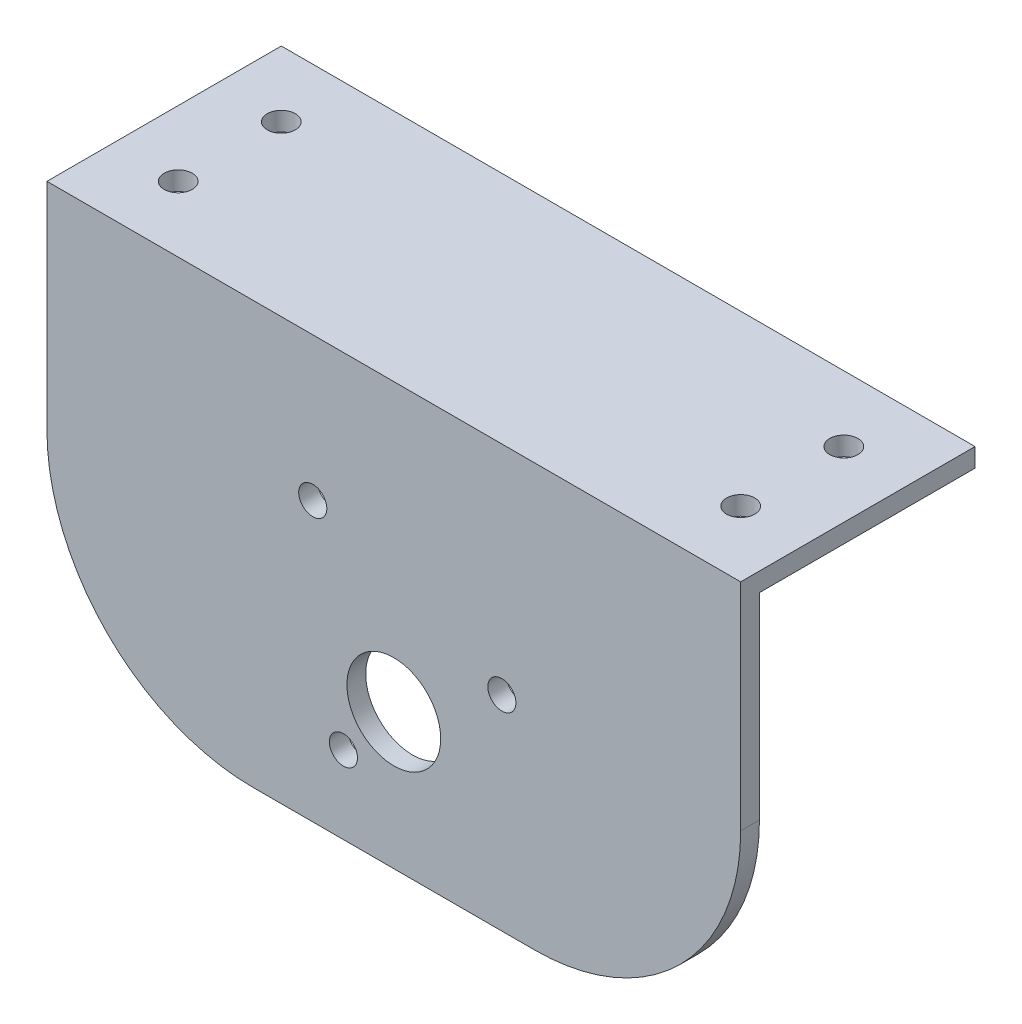
ISO-10303-21;
HEADER;
FILE_DESCRIPTION(('STEP AP214'),'2;1');
FILE_NAME('part.step','',(''),(''),'','','');
FILE_SCHEMA(('AUTOMOTIVE_DESIGN { 1 0 10303 214 1 1 1 1 }'));
ENDSEC;
DATA;
#1=APPLICATION_CONTEXT('core data for automotive mechanical design processes');
#2=APPLICATION_PROTOCOL_DEFINITION('international standard','automotive_design',2000,#1);
#3=PRODUCT_CONTEXT('',#1,'mechanical');
#4=PRODUCT('Part','Part','',(#3));
#5=PRODUCT_RELATED_PRODUCT_CATEGORY('part','',(#4));
#6=PRODUCT_DEFINITION_FORMATION('','',#4);
#7=PRODUCT_DEFINITION_CONTEXT('part definition',#1,'design');
#8=PRODUCT_DEFINITION('design','',#6,#7);
#9=PRODUCT_DEFINITION_SHAPE('','',#8);
#10=(LENGTH_UNIT() NAMED_UNIT(*) SI_UNIT(.MILLI.,.METRE.));
#11=(NAMED_UNIT(*) PLANE_ANGLE_UNIT() SI_UNIT($,.RADIAN.));
#12=(NAMED_UNIT(*) SI_UNIT($,.STERADIAN.) SOLID_ANGLE_UNIT());
#13=UNCERTAINTY_MEASURE_WITH_UNIT(LENGTH_MEASURE(1.E-05),#10,'distance_accuracy_value','');
#14=(GEOMETRIC_REPRESENTATION_CONTEXT(3) GLOBAL_UNCERTAINTY_ASSIGNED_CONTEXT((#13)) GLOBAL_UNIT_ASSIGNED_CONTEXT((#10,
#11,#12)) REPRESENTATION_CONTEXT('',''));
#15=CARTESIAN_POINT('',(0.,0.,0.));
#16=DIRECTION('',(0.,0.,1.));
#17=DIRECTION('',(1.,0.,0.));
#18=AXIS2_PLACEMENT_3D('',#15,#16,#17);
#19=CARTESIAN_POINT('',(0.,0.,0.));
#20=DIRECTION('',(0.,-1.,0.));
#21=DIRECTION('',(0.,0.,-1.));
#22=AXIS2_PLACEMENT_3D('',#19,#20,#21);
#23=PLANE('',#22);
#24=CARTESIAN_POINT('',(67.,0.,-7.));
#25=DIRECTION('',(0.,1.,0.));
#26=DIRECTION('',(0.,0.,1.));
#27=AXIS2_PLACEMENT_3D('',#24,#25,#26);
#28=CIRCLE('',#27,1.5);
#29=CARTESIAN_POINT('',(67.,0.,-5.50000000000001));
#30=VERTEX_POINT('',#29);
#31=EDGE_CURVE('E151',#30,#30,#28,.T.);
#32=ORIENTED_EDGE('',*,*,#31,.T.);
#33=EDGE_LOOP('',(#32));
#34=FACE_BOUND('',#33,.T.);
#35=CARTESIAN_POINT('',(67.,0.,-18.));
#36=DIRECTION('',(0.,1.,0.));
#37=DIRECTION('',(0.,0.,1.));
#38=AXIS2_PLACEMENT_3D('',#35,#36,#37);
#39=CIRCLE('',#38,1.5);
#40=CARTESIAN_POINT('',(67.,0.,-16.5));
#41=VERTEX_POINT('',#40);
#42=EDGE_CURVE('E139',#41,#41,#39,.T.);
#43=ORIENTED_EDGE('',*,*,#42,.T.);
#44=EDGE_LOOP('',(#43));
#45=FACE_BOUND('',#44,.T.);
#46=CARTESIAN_POINT('',(7.,0.,-18.));
#47=DIRECTION('',(0.,1.,0.));
#48=DIRECTION('',(0.,0.,1.));
#49=AXIS2_PLACEMENT_3D('',#46,#47,#48);
#50=CIRCLE('',#49,1.5);
#51=CARTESIAN_POINT('',(7.,0.,-16.5));
#52=VERTEX_POINT('',#51);
#53=EDGE_CURVE('E133',#52,#52,#50,.T.);
#54=ORIENTED_EDGE('',*,*,#53,.T.);
#55=EDGE_LOOP('',(#54));
#56=FACE_BOUND('',#55,.T.);
#57=CARTESIAN_POINT('',(7.,0.,-7.));
#58=DIRECTION('',(0.,1.,0.));
#59=DIRECTION('',(0.,0.,1.));
#60=AXIS2_PLACEMENT_3D('',#57,#58,#59);
#61=CIRCLE('',#60,1.5);
#62=CARTESIAN_POINT('',(7.,0.,-5.5));
#63=VERTEX_POINT('',#62);
#64=EDGE_CURVE('E145',#63,#63,#61,.T.);
#65=ORIENTED_EDGE('',*,*,#64,.T.);
#66=EDGE_LOOP('',(#65));
#67=FACE_BOUND('',#66,.T.);
#68=DIRECTION('',(0.,0.,-1.));
#69=VECTOR('',#68,1.);
#70=CARTESIAN_POINT('',(74.,0.,0.));
#71=LINE('',#70,#69);
#72=CARTESIAN_POINT('',(74.,0.,-2.));
#73=VERTEX_POINT('',#72);
#74=CARTESIAN_POINT('',(74.,0.,-25.));
#75=VERTEX_POINT('',#74);
#76=EDGE_CURVE('E66',#73,#75,#71,.T.);
#77=ORIENTED_EDGE('',*,*,#76,.F.);
#78=DIRECTION('',(-1.,0.,0.));
#79=VECTOR('',#78,1.);
#80=CARTESIAN_POINT('',(0.,0.,-2.));
#81=LINE('',#80,#79);
#82=CARTESIAN_POINT('',(0.,0.,-2.));
#83=VERTEX_POINT('',#82);
#84=EDGE_CURVE('E77',#73,#83,#81,.T.);
#85=ORIENTED_EDGE('',*,*,#84,.T.);
#86=DIRECTION('',(0.,0.,1.));
#87=VECTOR('',#86,1.);
#88=CARTESIAN_POINT('',(0.,0.,0.));
#89=LINE('',#88,#87);
#90=CARTESIAN_POINT('',(0.,0.,-25.));
#91=VERTEX_POINT('',#90);
#92=EDGE_CURVE('E112',#91,#83,#89,.T.);
#93=ORIENTED_EDGE('',*,*,#92,.F.);
#94=DIRECTION('',(-1.,0.,0.));
#95=VECTOR('',#94,1.);
#96=CARTESIAN_POINT('',(0.,0.,-25.));
#97=LINE('',#96,#95);
#98=EDGE_CURVE('E117',#75,#91,#97,.T.);
#99=ORIENTED_EDGE('',*,*,#98,.F.);
#100=EDGE_LOOP('',(#77,#85,#93,#99));
#101=FACE_BOUND('',#100,.T.);
#102=ADVANCED_FACE('F37',(#34,#45,#56,#67,#101),#23,.T.);
#103=CARTESIAN_POINT('',(0.,2.,0.));
#104=DIRECTION('',(0.,-1.,0.));
#105=DIRECTION('',(0.,0.,-1.));
#106=AXIS2_PLACEMENT_3D('',#103,#104,#105);
#107=PLANE('',#106);
#108=DIRECTION('',(0.,0.,-1.));
#109=VECTOR('',#108,1.);
#110=CARTESIAN_POINT('',(74.,2.,0.));
#111=LINE('',#110,#109);
#112=CARTESIAN_POINT('',(74.,2.,0.));
#113=VERTEX_POINT('',#112);
#114=CARTESIAN_POINT('',(74.,2.,-25.));
#115=VERTEX_POINT('',#114);
#116=EDGE_CURVE('E89',#113,#115,#111,.T.);
#117=ORIENTED_EDGE('',*,*,#116,.T.);
#118=DIRECTION('',(-1.,0.,0.));
#119=VECTOR('',#118,1.);
#120=CARTESIAN_POINT('',(0.,2.,-25.));
#121=LINE('',#120,#119);
#122=CARTESIAN_POINT('',(0.,2.,-25.));
#123=VERTEX_POINT('',#122);
#124=EDGE_CURVE('E54',#115,#123,#121,.T.);
#125=ORIENTED_EDGE('',*,*,#124,.T.);
#126=DIRECTION('',(0.,0.,1.));
#127=VECTOR('',#126,1.);
#128=CARTESIAN_POINT('',(0.,2.,0.));
#129=LINE('',#128,#127);
#130=CARTESIAN_POINT('',(0.,2.,0.));
#131=VERTEX_POINT('',#130);
#132=EDGE_CURVE('E91',#123,#131,#129,.T.);
#133=ORIENTED_EDGE('',*,*,#132,.T.);
#134=DIRECTION('',(1.,0.,0.));
#135=VECTOR('',#134,1.);
#136=CARTESIAN_POINT('',(0.,2.,0.));
#137=LINE('',#136,#135);
#138=EDGE_CURVE('E84',#131,#113,#137,.T.);
#139=ORIENTED_EDGE('',*,*,#138,.T.);
#140=EDGE_LOOP('',(#117,#125,#133,#139));
#141=FACE_BOUND('',#140,.T.);
#142=CARTESIAN_POINT('',(67.,2.,-7.));
#143=DIRECTION('',(0.,1.,0.));
#144=DIRECTION('',(0.,0.,1.));
#145=AXIS2_PLACEMENT_3D('',#142,#143,#144);
#146=CIRCLE('',#145,1.5);
#147=CARTESIAN_POINT('',(67.,2.,-5.50000000000001));
#148=VERTEX_POINT('',#147);
#149=EDGE_CURVE('E148',#148,#148,#146,.T.);
#150=ORIENTED_EDGE('',*,*,#149,.F.);
#151=EDGE_LOOP('',(#150));
#152=FACE_BOUND('',#151,.T.);
#153=CARTESIAN_POINT('',(67.,2.,-18.));
#154=DIRECTION('',(0.,1.,0.));
#155=DIRECTION('',(0.,0.,1.));
#156=AXIS2_PLACEMENT_3D('',#153,#154,#155);
#157=CIRCLE('',#156,1.5);
#158=CARTESIAN_POINT('',(67.,2.,-16.5));
#159=VERTEX_POINT('',#158);
#160=EDGE_CURVE('E136',#159,#159,#157,.T.);
#161=ORIENTED_EDGE('',*,*,#160,.F.);
#162=EDGE_LOOP('',(#161));
#163=FACE_BOUND('',#162,.T.);
#164=CARTESIAN_POINT('',(7.,2.,-18.));
#165=DIRECTION('',(0.,1.,0.));
#166=DIRECTION('',(0.,0.,1.));
#167=AXIS2_PLACEMENT_3D('',#164,#165,#166);
#168=CIRCLE('',#167,1.5);
#169=CARTESIAN_POINT('',(7.,2.,-16.5));
#170=VERTEX_POINT('',#169);
#171=EDGE_CURVE('E115',#170,#170,#168,.T.);
#172=ORIENTED_EDGE('',*,*,#171,.F.);
#173=EDGE_LOOP('',(#172));
#174=FACE_BOUND('',#173,.T.);
#175=CARTESIAN_POINT('',(7.,2.,-7.));
#176=DIRECTION('',(0.,1.,0.));
#177=DIRECTION('',(0.,0.,1.));
#178=AXIS2_PLACEMENT_3D('',#175,#176,#177);
#179=CIRCLE('',#178,1.5);
#180=CARTESIAN_POINT('',(7.,2.,-5.5));
#181=VERTEX_POINT('',#180);
#182=EDGE_CURVE('E142',#181,#181,#179,.T.);
#183=ORIENTED_EDGE('',*,*,#182,.F.);
#184=EDGE_LOOP('',(#183));
#185=FACE_BOUND('',#184,.T.);
#186=ADVANCED_FACE('F86',(#141,#152,#163,#174,#185),#107,.F.);
#187=CARTESIAN_POINT('',(0.,2.,0.));
#188=DIRECTION('',(1.,0.,0.));
#189=DIRECTION('',(0.,0.,-1.));
#190=AXIS2_PLACEMENT_3D('',#187,#188,#189);
#191=PLANE('',#190);
#192=DIRECTION('',(0.,-1.,0.));
#193=VECTOR('',#192,1.);
#194=CARTESIAN_POINT('',(0.,2.,0.));
#195=LINE('',#194,#193);
#196=CARTESIAN_POINT('',(0.,-20.9999999999998,0.));
#197=VERTEX_POINT('',#196);
#198=EDGE_CURVE('E11',#131,#197,#195,.T.);
#199=ORIENTED_EDGE('',*,*,#198,.F.);
#200=ORIENTED_EDGE('',*,*,#132,.F.);
#201=DIRECTION('',(0.,-1.,0.));
#202=VECTOR('',#201,1.);
#203=CARTESIAN_POINT('',(0.,2.,-25.));
#204=LINE('',#203,#202);
#205=EDGE_CURVE('E108',#123,#91,#204,.T.);
#206=ORIENTED_EDGE('',*,*,#205,.T.);
#207=ORIENTED_EDGE('',*,*,#92,.T.);
#208=DIRECTION('',(0.,-1.,0.));
#209=VECTOR('',#208,1.);
#210=CARTESIAN_POINT('',(0.,2.,-2.));
#211=LINE('',#210,#209);
#212=CARTESIAN_POINT('',(0.,-20.9999999999998,-2.));
#213=VERTEX_POINT('',#212);
#214=EDGE_CURVE('E130',#83,#213,#211,.T.);
#215=ORIENTED_EDGE('',*,*,#214,.T.);
#216=DIRECTION('',(0.,0.,1.));
#217=VECTOR('',#216,1.);
#218=CARTESIAN_POINT('',(0.,-20.9999999999998,-2.));
#219=LINE('',#218,#217);
#220=EDGE_CURVE('E158',#213,#197,#219,.T.);
#221=ORIENTED_EDGE('',*,*,#220,.T.);
#222=EDGE_LOOP('',(#199,#200,#206,#207,#215,#221));
#223=FACE_BOUND('',#222,.T.);
#224=ADVANCED_FACE('F39',(#223),#191,.F.);
#225=CARTESIAN_POINT('',(0.,2.,0.));
#226=DIRECTION('',(0.,0.,-1.));
#227=DIRECTION('',(-1.,0.,0.));
#228=AXIS2_PLACEMENT_3D('',#225,#226,#227);
#229=PLANE('',#228);
#230=ORIENTED_EDGE('',*,*,#198,.T.);
#231=CARTESIAN_POINT('',(22.,-21.,0.));
#232=DIRECTION('',(0.,0.,1.));
#233=DIRECTION('',(1.,0.,0.));
#234=AXIS2_PLACEMENT_3D('',#231,#232,#233);
#235=CIRCLE('',#234,22.);
#236=CARTESIAN_POINT('',(22.0000000000002,-43.,0.));
#237=VERTEX_POINT('',#236);
#238=EDGE_CURVE('E171',#197,#237,#235,.T.);
#239=ORIENTED_EDGE('',*,*,#238,.T.);
#240=DIRECTION('',(1.,0.,0.));
#241=VECTOR('',#240,1.);
#242=CARTESIAN_POINT('',(22.0000000000002,-43.,0.));
#243=LINE('',#242,#241);
#244=CARTESIAN_POINT('',(51.9999999999998,-43.,0.));
#245=VERTEX_POINT('',#244);
#246=EDGE_CURVE('E169',#237,#245,#243,.T.);
#247=ORIENTED_EDGE('',*,*,#246,.T.);
#248=CARTESIAN_POINT('',(52.,-21.,0.));
#249=DIRECTION('',(0.,0.,1.));
#250=DIRECTION('',(1.,0.,0.));
#251=AXIS2_PLACEMENT_3D('',#248,#249,#250);
#252=CIRCLE('',#251,22.);
#253=CARTESIAN_POINT('',(74.,-20.9999999999998,0.));
#254=VERTEX_POINT('',#253);
#255=EDGE_CURVE('E102',#245,#254,#252,.T.);
#256=ORIENTED_EDGE('',*,*,#255,.T.);
#257=DIRECTION('',(0.,-1.,0.));
#258=VECTOR('',#257,1.);
#259=CARTESIAN_POINT('',(74.,2.,0.));
#260=LINE('',#259,#258);
#261=EDGE_CURVE('E46',#113,#254,#260,.T.);
#262=ORIENTED_EDGE('',*,*,#261,.F.);
#263=ORIENTED_EDGE('',*,*,#138,.F.);
#264=EDGE_LOOP('',(#230,#239,#247,#256,#262,#263));
#265=FACE_BOUND('',#264,.T.);
#266=CARTESIAN_POINT('',(31.6267563454795,-34.7088452717711,0.));
#267=DIRECTION('',(0.,0.,1.));
#268=DIRECTION('',(1.,0.,0.));
#269=AXIS2_PLACEMENT_3D('',#266,#267,#268);
#270=CIRCLE('',#269,1.5);
#271=CARTESIAN_POINT('',(33.1267563454795,-34.7088452717711,0.));
#272=VERTEX_POINT('',#271);
#273=EDGE_CURVE('E204',#272,#272,#270,.T.);
#274=ORIENTED_EDGE('',*,*,#273,.F.);
#275=EDGE_LOOP('',(#274));
#276=FACE_BOUND('',#275,.T.);
#277=CARTESIAN_POINT('',(48.5250282215109,-21.1737646438721,0.));
#278=DIRECTION('',(0.,0.,1.));
#279=DIRECTION('',(1.,0.,0.));
#280=AXIS2_PLACEMENT_3D('',#277,#278,#279);
#281=CIRCLE('',#280,1.5);
#282=CARTESIAN_POINT('',(50.0250282215109,-21.1737646438721,0.));
#283=VERTEX_POINT('',#282);
#284=EDGE_CURVE('E198',#283,#283,#281,.T.);
#285=ORIENTED_EDGE('',*,*,#284,.F.);
#286=EDGE_LOOP('',(#285));
#287=FACE_BOUND('',#286,.T.);
#288=CARTESIAN_POINT('',(28.354168617464,-13.3069722331223,0.));
#289=DIRECTION('',(0.,0.,1.));
#290=DIRECTION('',(1.,0.,0.));
#291=AXIS2_PLACEMENT_3D('',#288,#289,#290);
#292=CIRCLE('',#291,1.5);
#293=CARTESIAN_POINT('',(29.854168617464,-13.3069722331223,0.));
#294=VERTEX_POINT('',#293);
#295=EDGE_CURVE('E192',#294,#294,#292,.T.);
#296=ORIENTED_EDGE('',*,*,#295,.F.);
#297=EDGE_LOOP('',(#296));
#298=FACE_BOUND('',#297,.T.);
#299=CARTESIAN_POINT('',(37.,-28.5,0.));
#300=DIRECTION('',(0.,0.,1.));
#301=DIRECTION('',(1.,0.,0.));
#302=AXIS2_PLACEMENT_3D('',#299,#300,#301);
#303=CIRCLE('',#302,5.);
#304=CARTESIAN_POINT('',(42.,-28.5,0.));
#305=VERTEX_POINT('',#304);
#306=EDGE_CURVE('E186',#305,#305,#303,.T.);
#307=ORIENTED_EDGE('',*,*,#306,.F.);
#308=EDGE_LOOP('',(#307));
#309=FACE_BOUND('',#308,.T.);
#310=ADVANCED_FACE('F97',(#265,#276,#287,#298,#309),#229,.F.);
#311=CARTESIAN_POINT('',(74.,2.,0.));
#312=DIRECTION('',(-1.,0.,0.));
#313=DIRECTION('',(0.,0.,1.));
#314=AXIS2_PLACEMENT_3D('',#311,#312,#313);
#315=PLANE('',#314);
#316=ORIENTED_EDGE('',*,*,#261,.T.);
#317=DIRECTION('',(0.,0.,1.));
#318=VECTOR('',#317,1.);
#319=CARTESIAN_POINT('',(74.,-20.9999999999998,-2.));
#320=LINE('',#319,#318);
#321=CARTESIAN_POINT('',(74.,-20.9999999999998,-2.));
#322=VERTEX_POINT('',#321);
#323=EDGE_CURVE('E157',#322,#254,#320,.T.);
#324=ORIENTED_EDGE('',*,*,#323,.F.);
#325=DIRECTION('',(0.,1.,0.));
#326=VECTOR('',#325,1.);
#327=CARTESIAN_POINT('',(74.,2.,-2.));
#328=LINE('',#327,#326);
#329=EDGE_CURVE('E161',#322,#73,#328,.T.);
#330=ORIENTED_EDGE('',*,*,#329,.T.);
#331=ORIENTED_EDGE('',*,*,#76,.T.);
#332=DIRECTION('',(0.,-1.,0.));
#333=VECTOR('',#332,1.);
#334=CARTESIAN_POINT('',(74.,2.,-25.));
#335=LINE('',#334,#333);
#336=EDGE_CURVE('E105',#115,#75,#335,.T.);
#337=ORIENTED_EDGE('',*,*,#336,.F.);
#338=ORIENTED_EDGE('',*,*,#116,.F.);
#339=EDGE_LOOP('',(#316,#324,#330,#331,#337,#338));
#340=FACE_BOUND('',#339,.T.);
#341=ADVANCED_FACE('F106',(#340),#315,.F.);
#342=CARTESIAN_POINT('',(0.,2.,-25.));
#343=DIRECTION('',(0.,0.,1.));
#344=DIRECTION('',(1.,0.,0.));
#345=AXIS2_PLACEMENT_3D('',#342,#343,#344);
#346=PLANE('',#345);
#347=ORIENTED_EDGE('',*,*,#98,.T.);
#348=ORIENTED_EDGE('',*,*,#205,.F.);
#349=ORIENTED_EDGE('',*,*,#124,.F.);
#350=ORIENTED_EDGE('',*,*,#336,.T.);
#351=EDGE_LOOP('',(#347,#348,#349,#350));
#352=FACE_BOUND('',#351,.T.);
#353=ADVANCED_FACE('F123',(#352),#346,.F.);
#354=CARTESIAN_POINT('',(7.,2.,-18.));
#355=DIRECTION('',(0.,-1.,0.));
#356=DIRECTION('',(0.,0.,-1.));
#357=AXIS2_PLACEMENT_3D('',#354,#355,#356);
#358=CYLINDRICAL_SURFACE('',#357,1.5);
#359=ORIENTED_EDGE('',*,*,#171,.T.);
#360=EDGE_LOOP('',(#359));
#361=FACE_BOUND('',#360,.T.);
#362=ORIENTED_EDGE('',*,*,#53,.F.);
#363=EDGE_LOOP('',(#362));
#364=FACE_BOUND('',#363,.T.);
#365=ADVANCED_FACE('F253',(#361,#364),#358,.F.);
#366=CARTESIAN_POINT('',(67.,2.,-18.));
#367=DIRECTION('',(0.,-1.,0.));
#368=DIRECTION('',(0.,0.,-1.));
#369=AXIS2_PLACEMENT_3D('',#366,#367,#368);
#370=CYLINDRICAL_SURFACE('',#369,1.5);
#371=ORIENTED_EDGE('',*,*,#160,.T.);
#372=EDGE_LOOP('',(#371));
#373=FACE_BOUND('',#372,.T.);
#374=ORIENTED_EDGE('',*,*,#42,.F.);
#375=EDGE_LOOP('',(#374));
#376=FACE_BOUND('',#375,.T.);
#377=ADVANCED_FACE('F271',(#373,#376),#370,.F.);
#378=CARTESIAN_POINT('',(7.,2.,-7.));
#379=DIRECTION('',(0.,-1.,0.));
#380=DIRECTION('',(0.,0.,-1.));
#381=AXIS2_PLACEMENT_3D('',#378,#379,#380);
#382=CYLINDRICAL_SURFACE('',#381,1.5);
#383=ORIENTED_EDGE('',*,*,#182,.T.);
#384=EDGE_LOOP('',(#383));
#385=FACE_BOUND('',#384,.T.);
#386=ORIENTED_EDGE('',*,*,#64,.F.);
#387=EDGE_LOOP('',(#386));
#388=FACE_BOUND('',#387,.T.);
#389=ADVANCED_FACE('F278',(#385,#388),#382,.F.);
#390=CARTESIAN_POINT('',(67.,2.,-7.));
#391=DIRECTION('',(0.,-1.,0.));
#392=DIRECTION('',(0.,0.,-1.));
#393=AXIS2_PLACEMENT_3D('',#390,#391,#392);
#394=CYLINDRICAL_SURFACE('',#393,1.5);
#395=ORIENTED_EDGE('',*,*,#149,.T.);
#396=EDGE_LOOP('',(#395));
#397=FACE_BOUND('',#396,.T.);
#398=ORIENTED_EDGE('',*,*,#31,.F.);
#399=EDGE_LOOP('',(#398));
#400=FACE_BOUND('',#399,.T.);
#401=ADVANCED_FACE('F286',(#397,#400),#394,.F.);
#402=CARTESIAN_POINT('',(52.,-21.,-2.));
#403=DIRECTION('',(0.,0.,1.));
#404=DIRECTION('',(1.,0.,0.));
#405=AXIS2_PLACEMENT_3D('',#402,#403,#404);
#406=CYLINDRICAL_SURFACE('',#405,22.);
#407=ORIENTED_EDGE('',*,*,#255,.F.);
#408=DIRECTION('',(0.,0.,1.));
#409=VECTOR('',#408,1.);
#410=CARTESIAN_POINT('',(51.9999999999998,-43.,-2.));
#411=LINE('',#410,#409);
#412=CARTESIAN_POINT('',(51.9999999999998,-43.,-2.));
#413=VERTEX_POINT('',#412);
#414=EDGE_CURVE('E164',#413,#245,#411,.T.);
#415=ORIENTED_EDGE('',*,*,#414,.F.);
#416=CARTESIAN_POINT('',(52.,-21.,-2.));
#417=DIRECTION('',(0.,0.,1.));
#418=DIRECTION('',(1.,0.,0.));
#419=AXIS2_PLACEMENT_3D('',#416,#417,#418);
#420=CIRCLE('',#419,22.);
#421=EDGE_CURVE('E176',#413,#322,#420,.T.);
#422=ORIENTED_EDGE('',*,*,#421,.T.);
#423=ORIENTED_EDGE('',*,*,#323,.T.);
#424=EDGE_LOOP('',(#407,#415,#422,#423));
#425=FACE_BOUND('',#424,.T.);
#426=ADVANCED_FACE('F294',(#425),#406,.T.);
#427=CARTESIAN_POINT('',(22.0000000000002,-43.,-2.));
#428=DIRECTION('',(0.,-1.,0.));
#429=DIRECTION('',(0.,0.,-1.));
#430=AXIS2_PLACEMENT_3D('',#427,#428,#429);
#431=PLANE('',#430);
#432=ORIENTED_EDGE('',*,*,#246,.F.);
#433=DIRECTION('',(0.,0.,1.));
#434=VECTOR('',#433,1.);
#435=CARTESIAN_POINT('',(22.0000000000002,-43.,-2.));
#436=LINE('',#435,#434);
#437=CARTESIAN_POINT('',(22.0000000000002,-43.,-2.));
#438=VERTEX_POINT('',#437);
#439=EDGE_CURVE('E160',#438,#237,#436,.T.);
#440=ORIENTED_EDGE('',*,*,#439,.F.);
#441=DIRECTION('',(1.,0.,0.));
#442=VECTOR('',#441,1.);
#443=CARTESIAN_POINT('',(22.0000000000002,-43.,-2.));
#444=LINE('',#443,#442);
#445=EDGE_CURVE('E179',#438,#413,#444,.T.);
#446=ORIENTED_EDGE('',*,*,#445,.T.);
#447=ORIENTED_EDGE('',*,*,#414,.T.);
#448=EDGE_LOOP('',(#432,#440,#446,#447));
#449=FACE_BOUND('',#448,.T.);
#450=ADVANCED_FACE('F301',(#449),#431,.T.);
#451=CARTESIAN_POINT('',(22.,-21.,-2.));
#452=DIRECTION('',(0.,0.,1.));
#453=DIRECTION('',(1.,0.,0.));
#454=AXIS2_PLACEMENT_3D('',#451,#452,#453);
#455=CYLINDRICAL_SURFACE('',#454,22.);
#456=ORIENTED_EDGE('',*,*,#238,.F.);
#457=ORIENTED_EDGE('',*,*,#220,.F.);
#458=CARTESIAN_POINT('',(22.,-21.,-2.));
#459=DIRECTION('',(0.,0.,1.));
#460=DIRECTION('',(1.,0.,0.));
#461=AXIS2_PLACEMENT_3D('',#458,#459,#460);
#462=CIRCLE('',#461,22.);
#463=EDGE_CURVE('E182',#213,#438,#462,.T.);
#464=ORIENTED_EDGE('',*,*,#463,.T.);
#465=ORIENTED_EDGE('',*,*,#439,.T.);
#466=EDGE_LOOP('',(#456,#457,#464,#465));
#467=FACE_BOUND('',#466,.T.);
#468=ADVANCED_FACE('F238',(#467),#455,.T.);
#469=CARTESIAN_POINT('',(22.,-21.,-2.));
#470=DIRECTION('',(0.,0.,1.));
#471=DIRECTION('',(1.,0.,0.));
#472=AXIS2_PLACEMENT_3D('',#469,#470,#471);
#473=PLANE('',#472);
#474=ORIENTED_EDGE('',*,*,#84,.F.);
#475=ORIENTED_EDGE('',*,*,#329,.F.);
#476=ORIENTED_EDGE('',*,*,#421,.F.);
#477=ORIENTED_EDGE('',*,*,#445,.F.);
#478=ORIENTED_EDGE('',*,*,#463,.F.);
#479=ORIENTED_EDGE('',*,*,#214,.F.);
#480=EDGE_LOOP('',(#474,#475,#476,#477,#478,#479));
#481=FACE_BOUND('',#480,.T.);
#482=CARTESIAN_POINT('',(31.6267563454795,-34.7088452717711,-2.));
#483=DIRECTION('',(0.,0.,1.));
#484=DIRECTION('',(1.,0.,0.));
#485=AXIS2_PLACEMENT_3D('',#482,#483,#484);
#486=CIRCLE('',#485,1.5);
#487=CARTESIAN_POINT('',(33.1267563454795,-34.7088452717711,-2.));
#488=VERTEX_POINT('',#487);
#489=EDGE_CURVE('E201',#488,#488,#486,.T.);
#490=ORIENTED_EDGE('',*,*,#489,.T.);
#491=EDGE_LOOP('',(#490));
#492=FACE_BOUND('',#491,.T.);
#493=CARTESIAN_POINT('',(48.5250282215109,-21.1737646438721,-2.));
#494=DIRECTION('',(0.,0.,1.));
#495=DIRECTION('',(1.,0.,0.));
#496=AXIS2_PLACEMENT_3D('',#493,#494,#495);
#497=CIRCLE('',#496,1.5);
#498=CARTESIAN_POINT('',(50.0250282215109,-21.1737646438721,-2.));
#499=VERTEX_POINT('',#498);
#500=EDGE_CURVE('E195',#499,#499,#497,.T.);
#501=ORIENTED_EDGE('',*,*,#500,.T.);
#502=EDGE_LOOP('',(#501));
#503=FACE_BOUND('',#502,.T.);
#504=CARTESIAN_POINT('',(28.354168617464,-13.3069722331223,-2.));
#505=DIRECTION('',(0.,0.,1.));
#506=DIRECTION('',(1.,0.,0.));
#507=AXIS2_PLACEMENT_3D('',#504,#505,#506);
#508=CIRCLE('',#507,1.5);
#509=CARTESIAN_POINT('',(29.854168617464,-13.3069722331223,-2.));
#510=VERTEX_POINT('',#509);
#511=EDGE_CURVE('E189',#510,#510,#508,.T.);
#512=ORIENTED_EDGE('',*,*,#511,.T.);
#513=EDGE_LOOP('',(#512));
#514=FACE_BOUND('',#513,.T.);
#515=CARTESIAN_POINT('',(37.,-28.5,-2.));
#516=DIRECTION('',(0.,0.,1.));
#517=DIRECTION('',(1.,0.,0.));
#518=AXIS2_PLACEMENT_3D('',#515,#516,#517);
#519=CIRCLE('',#518,5.);
#520=CARTESIAN_POINT('',(42.,-28.5,-2.));
#521=VERTEX_POINT('',#520);
#522=EDGE_CURVE('E174',#521,#521,#519,.T.);
#523=ORIENTED_EDGE('',*,*,#522,.T.);
#524=EDGE_LOOP('',(#523));
#525=FACE_BOUND('',#524,.T.);
#526=ADVANCED_FACE('F210',(#481,#492,#503,#514,#525),#473,.F.);
#527=CARTESIAN_POINT('',(37.,-28.5,-2.));
#528=DIRECTION('',(0.,0.,1.));
#529=DIRECTION('',(1.,0.,0.));
#530=AXIS2_PLACEMENT_3D('',#527,#528,#529);
#531=CYLINDRICAL_SURFACE('',#530,5.);
#532=ORIENTED_EDGE('',*,*,#522,.F.);
#533=EDGE_LOOP('',(#532));
#534=FACE_BOUND('',#533,.T.);
#535=ORIENTED_EDGE('',*,*,#306,.T.);
#536=EDGE_LOOP('',(#535));
#537=FACE_BOUND('',#536,.T.);
#538=ADVANCED_FACE('F227',(#534,#537),#531,.F.);
#539=CARTESIAN_POINT('',(28.354168617464,-13.3069722331223,-2.));
#540=DIRECTION('',(0.,0.,1.));
#541=DIRECTION('',(1.,0.,0.));
#542=AXIS2_PLACEMENT_3D('',#539,#540,#541);
#543=CYLINDRICAL_SURFACE('',#542,1.5);
#544=ORIENTED_EDGE('',*,*,#511,.F.);
#545=EDGE_LOOP('',(#544));
#546=FACE_BOUND('',#545,.T.);
#547=ORIENTED_EDGE('',*,*,#295,.T.);
#548=EDGE_LOOP('',(#547));
#549=FACE_BOUND('',#548,.T.);
#550=ADVANCED_FACE('F229',(#546,#549),#543,.F.);
#551=CARTESIAN_POINT('',(48.5250282215109,-21.1737646438721,-2.));
#552=DIRECTION('',(0.,0.,1.));
#553=DIRECTION('',(1.,0.,0.));
#554=AXIS2_PLACEMENT_3D('',#551,#552,#553);
#555=CYLINDRICAL_SURFACE('',#554,1.5);
#556=ORIENTED_EDGE('',*,*,#500,.F.);
#557=EDGE_LOOP('',(#556));
#558=FACE_BOUND('',#557,.T.);
#559=ORIENTED_EDGE('',*,*,#284,.T.);
#560=EDGE_LOOP('',(#559));
#561=FACE_BOUND('',#560,.T.);
#562=ADVANCED_FACE('F216',(#558,#561),#555,.F.);
#563=CARTESIAN_POINT('',(31.6267563454795,-34.7088452717711,-2.));
#564=DIRECTION('',(0.,0.,1.));
#565=DIRECTION('',(1.,0.,0.));
#566=AXIS2_PLACEMENT_3D('',#563,#564,#565);
#567=CYLINDRICAL_SURFACE('',#566,1.5);
#568=ORIENTED_EDGE('',*,*,#489,.F.);
#569=EDGE_LOOP('',(#568));
#570=FACE_BOUND('',#569,.T.);
#571=ORIENTED_EDGE('',*,*,#273,.T.);
#572=EDGE_LOOP('',(#571));
#573=FACE_BOUND('',#572,.T.);
#574=ADVANCED_FACE('F213',(#570,#573),#567,.F.);
#575=CLOSED_SHELL('',(#102,#186,#224,#310,#341,#353,#365,#377,#389,#401,#426,#450,#468,#526,
#538,#550,#562,#574));
#576=MANIFOLD_SOLID_BREP('B2',#575);
#577=ADVANCED_BREP_SHAPE_REPRESENTATION('',(#18,#576),#14);
#578=SHAPE_DEFINITION_REPRESENTATION(#9,#577);
ENDSEC;
END-ISO-10303-21;
